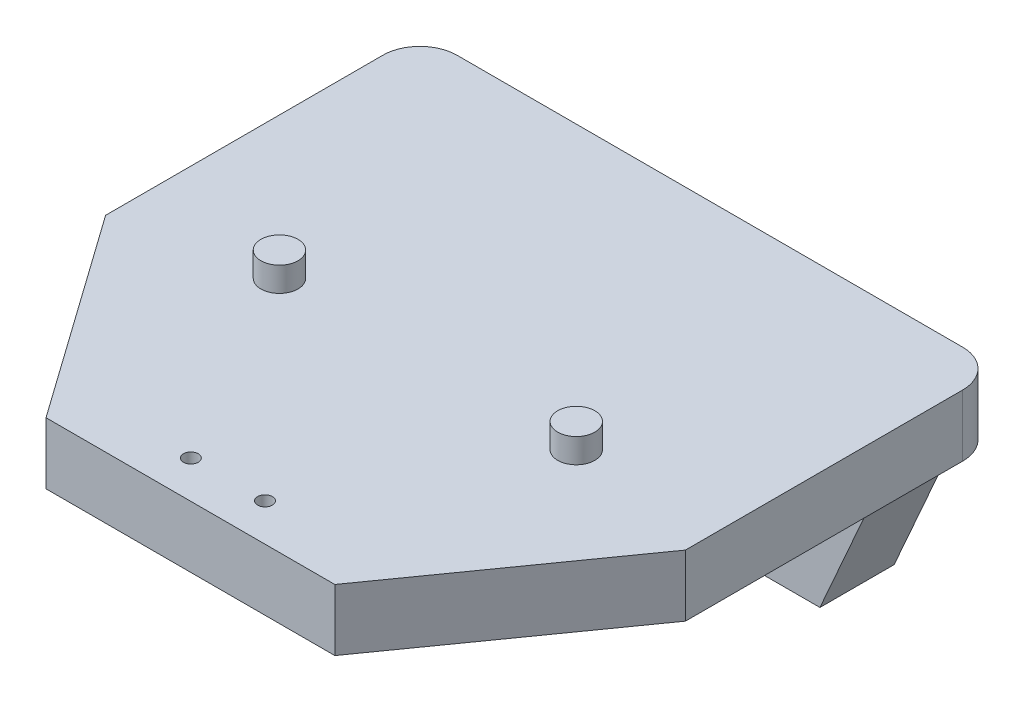
ISO-10303-21;
HEADER;
FILE_DESCRIPTION(('STEP AP214'),'2;1');
FILE_NAME('part.step','',(''),(''),'','','');
FILE_SCHEMA(('AUTOMOTIVE_DESIGN { 1 0 10303 214 1 1 1 1 }'));
ENDSEC;
DATA;
#1=APPLICATION_CONTEXT('core data for automotive mechanical design processes');
#2=APPLICATION_PROTOCOL_DEFINITION('international standard','automotive_design',2000,#1);
#3=PRODUCT_CONTEXT('',#1,'mechanical');
#4=PRODUCT('Part','Part','',(#3));
#5=PRODUCT_RELATED_PRODUCT_CATEGORY('part','',(#4));
#6=PRODUCT_DEFINITION_FORMATION('','',#4);
#7=PRODUCT_DEFINITION_CONTEXT('part definition',#1,'design');
#8=PRODUCT_DEFINITION('design','',#6,#7);
#9=PRODUCT_DEFINITION_SHAPE('','',#8);
#10=(LENGTH_UNIT() NAMED_UNIT(*) SI_UNIT(.MILLI.,.METRE.));
#11=(NAMED_UNIT(*) PLANE_ANGLE_UNIT() SI_UNIT($,.RADIAN.));
#12=(NAMED_UNIT(*) SI_UNIT($,.STERADIAN.) SOLID_ANGLE_UNIT());
#13=UNCERTAINTY_MEASURE_WITH_UNIT(LENGTH_MEASURE(1.E-05),#10,'distance_accuracy_value','');
#14=(GEOMETRIC_REPRESENTATION_CONTEXT(3) GLOBAL_UNCERTAINTY_ASSIGNED_CONTEXT((#13)) GLOBAL_UNIT_ASSIGNED_CONTEXT((#10,
#11,#12)) REPRESENTATION_CONTEXT('',''));
#15=CARTESIAN_POINT('',(0.,0.,0.));
#16=DIRECTION('',(0.,0.,1.));
#17=DIRECTION('',(1.,0.,0.));
#18=AXIS2_PLACEMENT_3D('',#15,#16,#17);
#19=CARTESIAN_POINT('',(-104.140000000012,4.99999999999999,10.));
#20=DIRECTION('',(0.,-1.,0.));
#21=DIRECTION('',(0.,0.,-1.));
#22=AXIS2_PLACEMENT_3D('',#19,#20,#21);
#23=PLANE('',#22);
#24=DIRECTION('',(0.,0.,-1.));
#25=VECTOR('',#24,1.);
#26=CARTESIAN_POINT('',(-104.140000000012,4.99999999999999,10.));
#27=LINE('',#26,#25);
#28=CARTESIAN_POINT('',(-104.140000000012,4.99999999999999,42.3558100361698));
#29=VERTEX_POINT('',#28);
#30=CARTESIAN_POINT('',(-104.140000000012,4.99999999999999,5.));
#31=VERTEX_POINT('',#30);
#32=EDGE_CURVE('E181',#29,#31,#27,.T.);
#33=ORIENTED_EDGE('',*,*,#32,.F.);
#34=DIRECTION('',(0.578556741023725,0.,0.815642138082631));
#35=VECTOR('',#34,1.);
#36=CARTESIAN_POINT('',(-119.408553300585,4.99999999999999,20.8303924298133));
#37=LINE('',#36,#35);
#38=CARTESIAN_POINT('',(-84.531238133795,4.99999999999999,70.));
#39=VERTEX_POINT('',#38);
#40=EDGE_CURVE('E138',#29,#39,#37,.T.);
#41=ORIENTED_EDGE('',*,*,#40,.T.);
#42=DIRECTION('',(-1.,0.,0.));
#43=VECTOR('',#42,1.);
#44=CARTESIAN_POINT('',(-25.9999999999991,4.99999999999999,70.));
#45=LINE('',#44,#43);
#46=CARTESIAN_POINT('',(-45.608761866216,4.99999999999999,70.));
#47=VERTEX_POINT('',#46);
#48=EDGE_CURVE('E275',#47,#39,#45,.T.);
#49=ORIENTED_EDGE('',*,*,#48,.F.);
#50=DIRECTION('',(0.578556741023725,0.,-0.815642138082631));
#51=VECTOR('',#50,1.);
#52=CARTESIAN_POINT('',(-36.8870850073432,4.99999999999999,57.7042878313898));
#53=LINE('',#52,#51);
#54=CARTESIAN_POINT('',(-25.9999999999991,4.99999999999999,42.3558100361698));
#55=VERTEX_POINT('',#54);
#56=EDGE_CURVE('E59',#47,#55,#53,.T.);
#57=ORIENTED_EDGE('',*,*,#56,.T.);
#58=DIRECTION('',(0.,0.,-1.));
#59=VECTOR('',#58,1.);
#60=CARTESIAN_POINT('',(-25.9999999999991,4.99999999999999,10.));
#61=LINE('',#60,#59);
#62=CARTESIAN_POINT('',(-25.9999999999991,4.99999999999999,5.));
#63=VERTEX_POINT('',#62);
#64=EDGE_CURVE('E190',#55,#63,#61,.T.);
#65=ORIENTED_EDGE('',*,*,#64,.T.);
#66=CARTESIAN_POINT('',(-30.9999999999991,4.99999999999999,5.));
#67=DIRECTION('',(0.,-1.,0.));
#68=DIRECTION('',(0.,0.,-1.));
#69=AXIS2_PLACEMENT_3D('',#66,#67,#68);
#70=CIRCLE('',#69,5.);
#71=CARTESIAN_POINT('',(-30.9999999999991,4.99999999999999,0.));
#72=VERTEX_POINT('',#71);
#73=EDGE_CURVE('E216',#63,#72,#70,.F.);
#74=ORIENTED_EDGE('',*,*,#73,.T.);
#75=DIRECTION('',(-1.,0.,0.));
#76=VECTOR('',#75,1.);
#77=CARTESIAN_POINT('',(-104.140000000012,4.99999999999999,0.));
#78=LINE('',#77,#76);
#79=CARTESIAN_POINT('',(-99.1400000000119,4.99999999999999,0.));
#80=VERTEX_POINT('',#79);
#81=EDGE_CURVE('E169',#72,#80,#78,.T.);
#82=ORIENTED_EDGE('',*,*,#81,.T.);
#83=CARTESIAN_POINT('',(-99.1400000000119,4.99999999999999,5.));
#84=DIRECTION('',(0.,-1.,0.));
#85=DIRECTION('',(0.,0.,-1.));
#86=AXIS2_PLACEMENT_3D('',#83,#84,#85);
#87=CIRCLE('',#86,5.);
#88=EDGE_CURVE('E213',#80,#31,#87,.F.);
#89=ORIENTED_EDGE('',*,*,#88,.T.);
#90=EDGE_LOOP('',(#33,#41,#49,#57,#65,#74,#82,#89));
#91=FACE_BOUND('',#90,.T.);
#92=CARTESIAN_POINT('',(-85.0700000000055,4.99999999999999,38.));
#93=DIRECTION('',(0.,-1.,0.));
#94=DIRECTION('',(0.,0.,-1.));
#95=AXIS2_PLACEMENT_3D('',#92,#93,#94);
#96=CIRCLE('',#95,2.50000000000001);
#97=CARTESIAN_POINT('',(-85.0700000000055,4.99999999999999,35.5));
#98=VERTEX_POINT('',#97);
#99=EDGE_CURVE('E238',#98,#98,#96,.T.);
#100=ORIENTED_EDGE('',*,*,#99,.T.);
#101=EDGE_LOOP('',(#100));
#102=FACE_BOUND('',#101,.T.);
#103=CARTESIAN_POINT('',(-45.0700000000055,4.99999999999999,38.));
#104=DIRECTION('',(0.,-1.,0.));
#105=DIRECTION('',(0.,0.,-1.));
#106=AXIS2_PLACEMENT_3D('',#103,#104,#105);
#107=CIRCLE('',#106,2.5);
#108=CARTESIAN_POINT('',(-45.0700000000055,4.99999999999999,35.5));
#109=VERTEX_POINT('',#108);
#110=EDGE_CURVE('E11',#109,#109,#107,.F.);
#111=ORIENTED_EDGE('',*,*,#110,.F.);
#112=EDGE_LOOP('',(#111));
#113=FACE_BOUND('',#112,.T.);
#114=CARTESIAN_POINT('',(-70.0700000000055,4.99999999999999,64.9453335250818));
#115=DIRECTION('',(0.,-1.,0.));
#116=DIRECTION('',(0.,0.,-1.));
#117=AXIS2_PLACEMENT_3D('',#114,#115,#116);
#118=CIRCLE('',#117,0.999999999999998);
#119=CARTESIAN_POINT('',(-70.0700000000055,4.99999999999999,63.9453335250818));
#120=VERTEX_POINT('',#119);
#121=EDGE_CURVE('E420',#120,#120,#118,.F.);
#122=ORIENTED_EDGE('',*,*,#121,.F.);
#123=EDGE_LOOP('',(#122));
#124=FACE_BOUND('',#123,.T.);
#125=CARTESIAN_POINT('',(-60.0700000000055,4.99999999999999,64.9453335250818));
#126=DIRECTION('',(0.,-1.,0.));
#127=DIRECTION('',(0.,0.,-1.));
#128=AXIS2_PLACEMENT_3D('',#125,#126,#127);
#129=CIRCLE('',#128,0.999999999999998);
#130=CARTESIAN_POINT('',(-60.0700000000055,4.99999999999999,63.9453335250818));
#131=VERTEX_POINT('',#130);
#132=EDGE_CURVE('E253',#131,#131,#129,.T.);
#133=ORIENTED_EDGE('',*,*,#132,.T.);
#134=EDGE_LOOP('',(#133));
#135=FACE_BOUND('',#134,.T.);
#136=ADVANCED_FACE('F36',(#91,#102,#113,#124,#135),#23,.F.);
#137=CARTESIAN_POINT('',(-104.140000000012,-3.30000000000001,70.));
#138=DIRECTION('',(0.,1.,0.));
#139=DIRECTION('',(0.,0.,1.));
#140=AXIS2_PLACEMENT_3D('',#137,#138,#139);
#141=PLANE('',#140);
#142=DIRECTION('',(1.,0.,0.));
#143=VECTOR('',#142,1.);
#144=CARTESIAN_POINT('',(-104.140000000012,-3.30000000000001,70.));
#145=LINE('',#144,#143);
#146=CARTESIAN_POINT('',(-84.531238133795,-3.30000000000001,70.));
#147=VERTEX_POINT('',#146);
#148=CARTESIAN_POINT('',(-45.6087618662161,-3.30000000000001,70.));
#149=VERTEX_POINT('',#148);
#150=EDGE_CURVE('E152',#147,#149,#145,.T.);
#151=ORIENTED_EDGE('',*,*,#150,.F.);
#152=DIRECTION('',(0.578556741023725,0.,0.815642138082631));
#153=VECTOR('',#152,1.);
#154=CARTESIAN_POINT('',(-84.531238133795,-3.30000000000001,70.));
#155=LINE('',#154,#153);
#156=CARTESIAN_POINT('',(-104.140000000012,-3.30000000000001,42.3558100361698));
#157=VERTEX_POINT('',#156);
#158=EDGE_CURVE('E51',#157,#147,#155,.T.);
#159=ORIENTED_EDGE('',*,*,#158,.F.);
#160=DIRECTION('',(0.,0.,-1.));
#161=VECTOR('',#160,1.);
#162=CARTESIAN_POINT('',(-104.140000000012,-3.30000000000001,70.));
#163=LINE('',#162,#161);
#164=CARTESIAN_POINT('',(-104.140000000012,-3.30000000000001,10.));
#165=VERTEX_POINT('',#164);
#166=EDGE_CURVE('E148',#157,#165,#163,.T.);
#167=ORIENTED_EDGE('',*,*,#166,.T.);
#168=DIRECTION('',(1.,0.,0.));
#169=VECTOR('',#168,1.);
#170=CARTESIAN_POINT('',(-104.140000000012,-3.30000000000001,10.));
#171=LINE('',#170,#169);
#172=CARTESIAN_POINT('',(-25.9999999999991,-3.30000000000001,10.));
#173=VERTEX_POINT('',#172);
#174=EDGE_CURVE('E272',#165,#173,#171,.T.);
#175=ORIENTED_EDGE('',*,*,#174,.T.);
#176=DIRECTION('',(0.,0.,-1.));
#177=VECTOR('',#176,1.);
#178=CARTESIAN_POINT('',(-25.9999999999991,-3.30000000000001,70.));
#179=LINE('',#178,#177);
#180=CARTESIAN_POINT('',(-25.9999999999991,-3.30000000000001,42.3558100361698));
#181=VERTEX_POINT('',#180);
#182=EDGE_CURVE('E160',#181,#173,#179,.T.);
#183=ORIENTED_EDGE('',*,*,#182,.F.);
#184=DIRECTION('',(0.578556741023725,0.,-0.815642138082631));
#185=VECTOR('',#184,1.);
#186=CARTESIAN_POINT('',(-45.6087618662161,-3.30000000000001,70.));
#187=LINE('',#186,#185);
#188=EDGE_CURVE('E261',#149,#181,#187,.T.);
#189=ORIENTED_EDGE('',*,*,#188,.F.);
#190=EDGE_LOOP('',(#151,#159,#167,#175,#183,#189));
#191=FACE_BOUND('',#190,.T.);
#192=CARTESIAN_POINT('',(-85.0700000000055,-3.30000000000001,38.));
#193=DIRECTION('',(0.,1.,0.));
#194=DIRECTION('',(0.,0.,1.));
#195=AXIS2_PLACEMENT_3D('',#192,#193,#194);
#196=CIRCLE('',#195,2.50000000000001);
#197=CARTESIAN_POINT('',(-85.0700000000055,-3.30000000000001,40.5));
#198=VERTEX_POINT('',#197);
#199=EDGE_CURVE('E44',#198,#198,#196,.F.);
#200=ORIENTED_EDGE('',*,*,#199,.F.);
#201=EDGE_LOOP('',(#200));
#202=FACE_BOUND('',#201,.T.);
#203=CARTESIAN_POINT('',(-45.0700000000055,-3.30000000000001,38.));
#204=DIRECTION('',(0.,1.,0.));
#205=DIRECTION('',(0.,0.,1.));
#206=AXIS2_PLACEMENT_3D('',#203,#204,#205);
#207=CIRCLE('',#206,2.5);
#208=CARTESIAN_POINT('',(-45.0700000000055,-3.30000000000001,40.5));
#209=VERTEX_POINT('',#208);
#210=EDGE_CURVE('E245',#209,#209,#207,.T.);
#211=ORIENTED_EDGE('',*,*,#210,.T.);
#212=EDGE_LOOP('',(#211));
#213=FACE_BOUND('',#212,.T.);
#214=CARTESIAN_POINT('',(-70.0700000000055,-3.30000000000001,64.9453335250818));
#215=DIRECTION('',(0.,1.,0.));
#216=DIRECTION('',(0.,0.,1.));
#217=AXIS2_PLACEMENT_3D('',#214,#215,#216);
#218=CIRCLE('',#217,0.999999999999998);
#219=CARTESIAN_POINT('',(-70.0700000000055,-3.30000000000001,65.9453335250818));
#220=VERTEX_POINT('',#219);
#221=EDGE_CURVE('E424',#220,#220,#218,.T.);
#222=ORIENTED_EDGE('',*,*,#221,.T.);
#223=EDGE_LOOP('',(#222));
#224=FACE_BOUND('',#223,.T.);
#225=CARTESIAN_POINT('',(-60.0700000000055,-3.30000000000001,64.9453335250818));
#226=DIRECTION('',(0.,-1.,0.));
#227=DIRECTION('',(0.,0.,-1.));
#228=AXIS2_PLACEMENT_3D('',#225,#226,#227);
#229=CIRCLE('',#228,0.999999999999998);
#230=CARTESIAN_POINT('',(-60.0700000000055,-3.30000000000001,63.9453335250818));
#231=VERTEX_POINT('',#230);
#232=EDGE_CURVE('E416',#231,#231,#229,.T.);
#233=ORIENTED_EDGE('',*,*,#232,.F.);
#234=EDGE_LOOP('',(#233));
#235=FACE_BOUND('',#234,.T.);
#236=ADVANCED_FACE('F145',(#191,#202,#213,#224,#235),#141,.F.);
#237=CARTESIAN_POINT('',(-104.140000000012,4.99999999999999,10.));
#238=DIRECTION('',(1.,0.,0.));
#239=DIRECTION('',(0.,0.,-1.));
#240=AXIS2_PLACEMENT_3D('',#237,#238,#239);
#241=PLANE('',#240);
#242=ORIENTED_EDGE('',*,*,#166,.F.);
#243=DIRECTION('',(0.,-1.,0.));
#244=VECTOR('',#243,1.);
#245=CARTESIAN_POINT('',(-104.140000000012,6.69999999999999,42.3558100361698));
#246=LINE('',#245,#244);
#247=EDGE_CURVE('E135',#29,#157,#246,.T.);
#248=ORIENTED_EDGE('',*,*,#247,.F.);
#249=ORIENTED_EDGE('',*,*,#32,.T.);
#250=DIRECTION('',(0.,-1.,0.));
#251=VECTOR('',#250,1.);
#252=CARTESIAN_POINT('',(-104.140000000012,4.99999999999999,5.));
#253=LINE('',#252,#251);
#254=CARTESIAN_POINT('',(-104.140000000012,-3.30308783227906,5.));
#255=VERTEX_POINT('',#254);
#256=EDGE_CURVE('E226',#31,#255,#253,.T.);
#257=ORIENTED_EDGE('',*,*,#256,.T.);
#258=DIRECTION('',(0.,0.,-1.));
#259=VECTOR('',#258,1.);
#260=CARTESIAN_POINT('',(-104.140000000012,-3.30308783227906,10.));
#261=LINE('',#260,#259);
#262=CARTESIAN_POINT('',(-104.140000000012,-3.30308783227906,10.));
#263=VERTEX_POINT('',#262);
#264=EDGE_CURVE('E207',#263,#255,#261,.T.);
#265=ORIENTED_EDGE('',*,*,#264,.F.);
#266=DIRECTION('',(0.,-1.,0.));
#267=VECTOR('',#266,1.);
#268=CARTESIAN_POINT('',(-104.140000000012,4.99999999999999,10.));
#269=LINE('',#268,#267);
#270=EDGE_CURVE('E158',#165,#263,#269,.T.);
#271=ORIENTED_EDGE('',*,*,#270,.F.);
#272=EDGE_LOOP('',(#242,#248,#249,#257,#265,#271));
#273=FACE_BOUND('',#272,.T.);
#274=ADVANCED_FACE('F156',(#273),#241,.F.);
#275=CARTESIAN_POINT('',(-104.140000000012,-3.30308783227906,10.));
#276=DIRECTION('',(0.,1.,0.));
#277=DIRECTION('',(0.,0.,1.));
#278=AXIS2_PLACEMENT_3D('',#275,#276,#277);
#279=PLANE('',#278);
#280=ORIENTED_EDGE('',*,*,#264,.T.);
#281=CARTESIAN_POINT('',(-99.1400000000119,-3.30308783227906,5.));
#282=DIRECTION('',(0.,1.,0.));
#283=DIRECTION('',(0.,0.,1.));
#284=AXIS2_PLACEMENT_3D('',#281,#282,#283);
#285=CIRCLE('',#284,5.);
#286=CARTESIAN_POINT('',(-99.4984375162096,-3.30308783227906,0.0128642943086118));
#287=VERTEX_POINT('',#286);
#288=EDGE_CURVE('E229',#255,#287,#285,.F.);
#289=ORIENTED_EDGE('',*,*,#288,.T.);
#290=DIRECTION('',(0.,0.,-1.));
#291=VECTOR('',#290,1.);
#292=CARTESIAN_POINT('',(-99.4984375162096,-3.30308783227906,10.));
#293=LINE('',#292,#291);
#294=CARTESIAN_POINT('',(-99.4984375162096,-3.30308783227906,10.));
#295=VERTEX_POINT('',#294);
#296=EDGE_CURVE('E204',#295,#287,#293,.T.);
#297=ORIENTED_EDGE('',*,*,#296,.F.);
#298=DIRECTION('',(1.,0.,0.));
#299=VECTOR('',#298,1.);
#300=CARTESIAN_POINT('',(-104.140000000012,-3.30308783227906,10.));
#301=LINE('',#300,#299);
#302=EDGE_CURVE('E168',#263,#295,#301,.T.);
#303=ORIENTED_EDGE('',*,*,#302,.F.);
#304=EDGE_LOOP('',(#280,#289,#297,#303));
#305=FACE_BOUND('',#304,.T.);
#306=ADVANCED_FACE('F333',(#305),#279,.F.);
#307=CARTESIAN_POINT('',(-99.4984375162096,-3.30308783227906,10.));
#308=DIRECTION('',(0.914598558718786,0.404363050227787,0.));
#309=DIRECTION('',(-0.404363050227787,0.914598558718786,0.));
#310=AXIS2_PLACEMENT_3D('',#307,#308,#309);
#311=PLANE('',#310);
#312=ORIENTED_EDGE('',*,*,#296,.T.);
#313=CARTESIAN_POINT('',(-99.1400000000119,-4.11381085833337,5.));
#314=DIRECTION('',(0.914598558718786,0.404363050227787,0.));
#315=DIRECTION('',(0.404363050227787,-0.914598558718786,0.));
#316=AXIS2_PLACEMENT_3D('',#313,#314,#315);
#317=ELLIPSE('',#316,12.365125837248,5.);
#318=CARTESIAN_POINT('',(-99.1400000000119,-4.11381085833337,0.));
#319=VERTEX_POINT('',#318);
#320=EDGE_CURVE('E231',#287,#319,#317,.F.);
#321=ORIENTED_EDGE('',*,*,#320,.T.);
#322=DIRECTION('',(0.404363050227787,-0.914598558718786,0.));
#323=VECTOR('',#322,1.);
#324=CARTESIAN_POINT('',(-99.4984375162096,-3.30308783227906,0.));
#325=LINE('',#324,#323);
#326=CARTESIAN_POINT('',(-89.9057812616948,-25.0000000000001,0.));
#327=VERTEX_POINT('',#326);
#328=EDGE_CURVE('E159',#319,#327,#325,.T.);
#329=ORIENTED_EDGE('',*,*,#328,.T.);
#330=DIRECTION('',(0.,0.,-1.));
#331=VECTOR('',#330,1.);
#332=CARTESIAN_POINT('',(-89.9057812616948,-25.0000000000001,10.));
#333=LINE('',#332,#331);
#334=CARTESIAN_POINT('',(-89.9057812616948,-25.0000000000001,10.));
#335=VERTEX_POINT('',#334);
#336=EDGE_CURVE('E201',#335,#327,#333,.T.);
#337=ORIENTED_EDGE('',*,*,#336,.F.);
#338=DIRECTION('',(0.404363050227787,-0.914598558718786,0.));
#339=VECTOR('',#338,1.);
#340=CARTESIAN_POINT('',(-99.4984375162096,-3.30308783227906,10.));
#341=LINE('',#340,#339);
#342=EDGE_CURVE('E171',#295,#335,#341,.T.);
#343=ORIENTED_EDGE('',*,*,#342,.F.);
#344=EDGE_LOOP('',(#312,#321,#329,#337,#343));
#345=FACE_BOUND('',#344,.T.);
#346=ADVANCED_FACE('F329',(#345),#311,.F.);
#347=CARTESIAN_POINT('',(-89.9057812616948,-25.0000000000001,10.));
#348=DIRECTION('',(0.,1.,0.));
#349=DIRECTION('',(0.,0.,1.));
#350=AXIS2_PLACEMENT_3D('',#347,#348,#349);
#351=PLANE('',#350);
#352=DIRECTION('',(1.,0.,0.));
#353=VECTOR('',#352,1.);
#354=CARTESIAN_POINT('',(-89.9057812616948,-25.0000000000001,0.));
#355=LINE('',#354,#353);
#356=CARTESIAN_POINT('',(-40.2342187383163,-25.0000000000001,0.));
#357=VERTEX_POINT('',#356);
#358=EDGE_CURVE('E162',#327,#357,#355,.T.);
#359=ORIENTED_EDGE('',*,*,#358,.T.);
#360=DIRECTION('',(0.,0.,-1.));
#361=VECTOR('',#360,1.);
#362=CARTESIAN_POINT('',(-40.2342187383163,-25.0000000000001,10.));
#363=LINE('',#362,#361);
#364=CARTESIAN_POINT('',(-40.2342187383163,-25.0000000000001,10.));
#365=VERTEX_POINT('',#364);
#366=EDGE_CURVE('E198',#365,#357,#363,.T.);
#367=ORIENTED_EDGE('',*,*,#366,.F.);
#368=DIRECTION('',(1.,0.,0.));
#369=VECTOR('',#368,1.);
#370=CARTESIAN_POINT('',(-89.9057812616948,-25.0000000000001,10.));
#371=LINE('',#370,#369);
#372=EDGE_CURVE('E173',#335,#365,#371,.T.);
#373=ORIENTED_EDGE('',*,*,#372,.F.);
#374=ORIENTED_EDGE('',*,*,#336,.T.);
#375=EDGE_LOOP('',(#359,#367,#373,#374));
#376=FACE_BOUND('',#375,.T.);
#377=ADVANCED_FACE('F325',(#376),#351,.F.);
#378=CARTESIAN_POINT('',(-30.6415624838014,-3.30308783227906,10.));
#379=DIRECTION('',(-0.914598558718786,0.404363050227787,0.));
#380=DIRECTION('',(-0.404363050227787,-0.914598558718786,0.));
#381=AXIS2_PLACEMENT_3D('',#378,#379,#380);
#382=PLANE('',#381);
#383=DIRECTION('',(0.404363050227787,0.914598558718786,0.));
#384=VECTOR('',#383,1.);
#385=CARTESIAN_POINT('',(-30.6415624838014,-3.30308783227906,0.));
#386=LINE('',#385,#384);
#387=CARTESIAN_POINT('',(-30.9999999999991,-4.11381085833336,0.));
#388=VERTEX_POINT('',#387);
#389=EDGE_CURVE('E184',#357,#388,#386,.T.);
#390=ORIENTED_EDGE('',*,*,#389,.T.);
#391=CARTESIAN_POINT('',(-30.9999999999991,-4.11381085833336,5.));
#392=DIRECTION('',(-0.914598558718786,0.404363050227787,0.));
#393=DIRECTION('',(0.404363050227787,0.914598558718786,0.));
#394=AXIS2_PLACEMENT_3D('',#391,#392,#393);
#395=ELLIPSE('',#394,12.365125837248,5.);
#396=CARTESIAN_POINT('',(-30.6415624838014,-3.30308783227906,0.0128642943086083));
#397=VERTEX_POINT('',#396);
#398=EDGE_CURVE('E222',#388,#397,#395,.F.);
#399=ORIENTED_EDGE('',*,*,#398,.T.);
#400=DIRECTION('',(0.,0.,-1.));
#401=VECTOR('',#400,1.);
#402=CARTESIAN_POINT('',(-30.6415624838014,-3.30308783227906,10.));
#403=LINE('',#402,#401);
#404=CARTESIAN_POINT('',(-30.6415624838014,-3.30308783227906,10.));
#405=VERTEX_POINT('',#404);
#406=EDGE_CURVE('E195',#405,#397,#403,.T.);
#407=ORIENTED_EDGE('',*,*,#406,.F.);
#408=DIRECTION('',(0.404363050227787,0.914598558718786,0.));
#409=VECTOR('',#408,1.);
#410=CARTESIAN_POINT('',(-30.6415624838014,-3.30308783227906,10.));
#411=LINE('',#410,#409);
#412=EDGE_CURVE('E175',#365,#405,#411,.T.);
#413=ORIENTED_EDGE('',*,*,#412,.F.);
#414=ORIENTED_EDGE('',*,*,#366,.T.);
#415=EDGE_LOOP('',(#390,#399,#407,#413,#414));
#416=FACE_BOUND('',#415,.T.);
#417=ADVANCED_FACE('F321',(#416),#382,.F.);
#418=CARTESIAN_POINT('',(-25.9999999999991,-3.30308783227906,10.));
#419=DIRECTION('',(0.,1.,0.));
#420=DIRECTION('',(0.,0.,1.));
#421=AXIS2_PLACEMENT_3D('',#418,#419,#420);
#422=PLANE('',#421);
#423=ORIENTED_EDGE('',*,*,#406,.T.);
#424=CARTESIAN_POINT('',(-30.9999999999991,-3.30308783227906,5.));
#425=DIRECTION('',(0.,1.,0.));
#426=DIRECTION('',(0.,0.,1.));
#427=AXIS2_PLACEMENT_3D('',#424,#425,#426);
#428=CIRCLE('',#427,5.);
#429=CARTESIAN_POINT('',(-25.9999999999991,-3.30308783227906,5.));
#430=VERTEX_POINT('',#429);
#431=EDGE_CURVE('E224',#397,#430,#428,.F.);
#432=ORIENTED_EDGE('',*,*,#431,.T.);
#433=DIRECTION('',(0.,0.,-1.));
#434=VECTOR('',#433,1.);
#435=CARTESIAN_POINT('',(-25.9999999999991,-3.30308783227906,10.));
#436=LINE('',#435,#434);
#437=CARTESIAN_POINT('',(-25.9999999999991,-3.30308783227906,10.));
#438=VERTEX_POINT('',#437);
#439=EDGE_CURVE('E192',#438,#430,#436,.T.);
#440=ORIENTED_EDGE('',*,*,#439,.F.);
#441=DIRECTION('',(1.,0.,0.));
#442=VECTOR('',#441,1.);
#443=CARTESIAN_POINT('',(-25.9999999999991,-3.30308783227906,10.));
#444=LINE('',#443,#442);
#445=EDGE_CURVE('E177',#405,#438,#444,.T.);
#446=ORIENTED_EDGE('',*,*,#445,.F.);
#447=EDGE_LOOP('',(#423,#432,#440,#446));
#448=FACE_BOUND('',#447,.T.);
#449=ADVANCED_FACE('F318',(#448),#422,.F.);
#450=CARTESIAN_POINT('',(-25.9999999999991,4.99999999999999,10.));
#451=DIRECTION('',(-1.,0.,0.));
#452=DIRECTION('',(0.,0.,1.));
#453=AXIS2_PLACEMENT_3D('',#450,#451,#452);
#454=PLANE('',#453);
#455=ORIENTED_EDGE('',*,*,#64,.F.);
#456=DIRECTION('',(0.,-1.,0.));
#457=VECTOR('',#456,1.);
#458=CARTESIAN_POINT('',(-25.9999999999991,6.69999999999999,42.3558100361698));
#459=LINE('',#458,#457);
#460=EDGE_CURVE('E153',#55,#181,#459,.T.);
#461=ORIENTED_EDGE('',*,*,#460,.T.);
#462=ORIENTED_EDGE('',*,*,#182,.T.);
#463=DIRECTION('',(0.,1.,0.));
#464=VECTOR('',#463,1.);
#465=CARTESIAN_POINT('',(-25.9999999999991,4.99999999999999,10.));
#466=LINE('',#465,#464);
#467=EDGE_CURVE('E179',#438,#173,#466,.T.);
#468=ORIENTED_EDGE('',*,*,#467,.F.);
#469=ORIENTED_EDGE('',*,*,#439,.T.);
#470=DIRECTION('',(0.,1.,0.));
#471=VECTOR('',#470,1.);
#472=CARTESIAN_POINT('',(-25.9999999999991,4.99999999999999,5.));
#473=LINE('',#472,#471);
#474=EDGE_CURVE('E210',#430,#63,#473,.T.);
#475=ORIENTED_EDGE('',*,*,#474,.T.);
#476=EDGE_LOOP('',(#455,#461,#462,#468,#469,#475));
#477=FACE_BOUND('',#476,.T.);
#478=ADVANCED_FACE('F287',(#477),#454,.F.);
#479=CARTESIAN_POINT('',(0.,0.,10.));
#480=DIRECTION('',(0.,0.,1.));
#481=DIRECTION('',(1.,0.,0.));
#482=AXIS2_PLACEMENT_3D('',#479,#480,#481);
#483=PLANE('',#482);
#484=CARTESIAN_POINT('',(-65.0700000000056,-13.5000000000001,10.));
#485=DIRECTION('',(0.,0.,1.));
#486=DIRECTION('',(1.,0.,0.));
#487=AXIS2_PLACEMENT_3D('',#484,#485,#486);
#488=CIRCLE('',#487,7.5);
#489=CARTESIAN_POINT('',(-57.5700000000056,-13.5000000000001,10.));
#490=VERTEX_POINT('',#489);
#491=EDGE_CURVE('E268',#490,#490,#488,.T.);
#492=ORIENTED_EDGE('',*,*,#491,.F.);
#493=EDGE_LOOP('',(#492));
#494=FACE_BOUND('',#493,.T.);
#495=ORIENTED_EDGE('',*,*,#174,.F.);
#496=ORIENTED_EDGE('',*,*,#270,.T.);
#497=ORIENTED_EDGE('',*,*,#302,.T.);
#498=ORIENTED_EDGE('',*,*,#342,.T.);
#499=ORIENTED_EDGE('',*,*,#372,.T.);
#500=ORIENTED_EDGE('',*,*,#412,.T.);
#501=ORIENTED_EDGE('',*,*,#445,.T.);
#502=ORIENTED_EDGE('',*,*,#467,.T.);
#503=EDGE_LOOP('',(#495,#496,#497,#498,#499,#500,#501,#502));
#504=FACE_BOUND('',#503,.T.);
#505=ADVANCED_FACE('F280',(#494,#504),#483,.T.);
#506=CARTESIAN_POINT('',(0.,0.,0.));
#507=DIRECTION('',(0.,0.,1.));
#508=DIRECTION('',(1.,0.,0.));
#509=AXIS2_PLACEMENT_3D('',#506,#507,#508);
#510=PLANE('',#509);
#511=CARTESIAN_POINT('',(-65.0700000000056,-13.5000000000001,0.));
#512=DIRECTION('',(0.,0.,1.));
#513=DIRECTION('',(1.,0.,0.));
#514=AXIS2_PLACEMENT_3D('',#511,#512,#513);
#515=CIRCLE('',#514,7.5);
#516=CARTESIAN_POINT('',(-57.5700000000056,-13.5000000000001,0.));
#517=VERTEX_POINT('',#516);
#518=EDGE_CURVE('E269',#517,#517,#515,.T.);
#519=ORIENTED_EDGE('',*,*,#518,.T.);
#520=EDGE_LOOP('',(#519));
#521=FACE_BOUND('',#520,.T.);
#522=ORIENTED_EDGE('',*,*,#81,.F.);
#523=DIRECTION('',(0.,1.,0.));
#524=VECTOR('',#523,1.);
#525=CARTESIAN_POINT('',(-30.9999999999991,0.,0.));
#526=LINE('',#525,#524);
#527=EDGE_CURVE('E220',#72,#388,#526,.F.);
#528=ORIENTED_EDGE('',*,*,#527,.T.);
#529=ORIENTED_EDGE('',*,*,#389,.F.);
#530=ORIENTED_EDGE('',*,*,#358,.F.);
#531=ORIENTED_EDGE('',*,*,#328,.F.);
#532=DIRECTION('',(0.,-1.,0.));
#533=VECTOR('',#532,1.);
#534=CARTESIAN_POINT('',(-99.1400000000119,0.,0.));
#535=LINE('',#534,#533);
#536=EDGE_CURVE('E218',#319,#80,#535,.F.);
#537=ORIENTED_EDGE('',*,*,#536,.T.);
#538=EDGE_LOOP('',(#522,#528,#529,#530,#531,#537));
#539=FACE_BOUND('',#538,.T.);
#540=ADVANCED_FACE('F297',(#521,#539),#510,.F.);
#541=CARTESIAN_POINT('',(0.,0.,70.));
#542=DIRECTION('',(0.,0.,1.));
#543=DIRECTION('',(1.,0.,0.));
#544=AXIS2_PLACEMENT_3D('',#541,#542,#543);
#545=PLANE('',#544);
#546=DIRECTION('',(0.,1.,0.));
#547=VECTOR('',#546,1.);
#548=CARTESIAN_POINT('',(-84.531238133795,0.,70.));
#549=LINE('',#548,#547);
#550=EDGE_CURVE('E235',#147,#39,#549,.T.);
#551=ORIENTED_EDGE('',*,*,#550,.F.);
#552=ORIENTED_EDGE('',*,*,#150,.T.);
#553=DIRECTION('',(0.,-1.,0.));
#554=VECTOR('',#553,1.);
#555=CARTESIAN_POINT('',(-45.608761866216,0.,70.));
#556=LINE('',#555,#554);
#557=EDGE_CURVE('E233',#47,#149,#556,.T.);
#558=ORIENTED_EDGE('',*,*,#557,.F.);
#559=ORIENTED_EDGE('',*,*,#48,.T.);
#560=EDGE_LOOP('',(#551,#552,#558,#559));
#561=FACE_BOUND('',#560,.T.);
#562=ADVANCED_FACE('F294',(#561),#545,.T.);
#563=CARTESIAN_POINT('',(-65.0700000000056,-13.5000000000001,0.));
#564=DIRECTION('',(0.,0.,1.));
#565=DIRECTION('',(1.,0.,0.));
#566=AXIS2_PLACEMENT_3D('',#563,#564,#565);
#567=CYLINDRICAL_SURFACE('',#566,7.5);
#568=ORIENTED_EDGE('',*,*,#518,.F.);
#569=EDGE_LOOP('',(#568));
#570=FACE_BOUND('',#569,.T.);
#571=ORIENTED_EDGE('',*,*,#491,.T.);
#572=EDGE_LOOP('',(#571));
#573=FACE_BOUND('',#572,.T.);
#574=ADVANCED_FACE('F296',(#570,#573),#567,.F.);
#575=CARTESIAN_POINT('',(-30.9999999999991,4.99999999999999,5.));
#576=DIRECTION('',(0.,1.,0.));
#577=DIRECTION('',(0.,0.,1.));
#578=AXIS2_PLACEMENT_3D('',#575,#576,#577);
#579=CYLINDRICAL_SURFACE('',#578,5.);
#580=ORIENTED_EDGE('',*,*,#398,.F.);
#581=ORIENTED_EDGE('',*,*,#527,.F.);
#582=ORIENTED_EDGE('',*,*,#73,.F.);
#583=ORIENTED_EDGE('',*,*,#474,.F.);
#584=ORIENTED_EDGE('',*,*,#431,.F.);
#585=EDGE_LOOP('',(#580,#581,#582,#583,#584));
#586=FACE_BOUND('',#585,.T.);
#587=ADVANCED_FACE('F303',(#586),#579,.T.);
#588=CARTESIAN_POINT('',(-99.1400000000119,4.99999999999999,5.));
#589=DIRECTION('',(0.,-1.,0.));
#590=DIRECTION('',(0.,0.,-1.));
#591=AXIS2_PLACEMENT_3D('',#588,#589,#590);
#592=CYLINDRICAL_SURFACE('',#591,5.);
#593=ORIENTED_EDGE('',*,*,#88,.F.);
#594=ORIENTED_EDGE('',*,*,#536,.F.);
#595=ORIENTED_EDGE('',*,*,#320,.F.);
#596=ORIENTED_EDGE('',*,*,#288,.F.);
#597=ORIENTED_EDGE('',*,*,#256,.F.);
#598=EDGE_LOOP('',(#593,#594,#595,#596,#597));
#599=FACE_BOUND('',#598,.T.);
#600=ADVANCED_FACE('F38',(#599),#592,.T.);
#601=CARTESIAN_POINT('',(-45.6087618662161,6.69999999999999,70.));
#602=DIRECTION('',(-0.815642138082631,0.,-0.578556741023725));
#603=DIRECTION('',(-0.578556741023725,0.,0.815642138082631));
#604=AXIS2_PLACEMENT_3D('',#601,#602,#603);
#605=PLANE('',#604);
#606=ORIENTED_EDGE('',*,*,#557,.T.);
#607=ORIENTED_EDGE('',*,*,#188,.T.);
#608=ORIENTED_EDGE('',*,*,#460,.F.);
#609=ORIENTED_EDGE('',*,*,#56,.F.);
#610=EDGE_LOOP('',(#606,#607,#608,#609));
#611=FACE_BOUND('',#610,.T.);
#612=ADVANCED_FACE('F289',(#611),#605,.F.);
#613=CARTESIAN_POINT('',(-84.531238133795,6.69999999999999,70.));
#614=DIRECTION('',(0.815642138082631,0.,-0.578556741023725));
#615=DIRECTION('',(-0.578556741023725,0.,-0.815642138082631));
#616=AXIS2_PLACEMENT_3D('',#613,#614,#615);
#617=PLANE('',#616);
#618=ORIENTED_EDGE('',*,*,#247,.T.);
#619=ORIENTED_EDGE('',*,*,#158,.T.);
#620=ORIENTED_EDGE('',*,*,#550,.T.);
#621=ORIENTED_EDGE('',*,*,#40,.F.);
#622=EDGE_LOOP('',(#618,#619,#620,#621));
#623=FACE_BOUND('',#622,.T.);
#624=ADVANCED_FACE('F136',(#623),#617,.F.);
#625=CARTESIAN_POINT('',(-85.0700000000055,-8.30000000000001,38.));
#626=DIRECTION('',(0.,1.,0.));
#627=DIRECTION('',(0.,0.,1.));
#628=AXIS2_PLACEMENT_3D('',#625,#626,#627);
#629=CYLINDRICAL_SURFACE('',#628,2.50000000000001);
#630=CARTESIAN_POINT('',(-85.0700000000055,-8.30000000000001,38.));
#631=DIRECTION('',(0.,-1.,0.));
#632=DIRECTION('',(0.,0.,-1.));
#633=AXIS2_PLACEMENT_3D('',#630,#631,#632);
#634=CIRCLE('',#633,2.50000000000001);
#635=CARTESIAN_POINT('',(-85.0700000000055,-8.30000000000001,35.5));
#636=VERTEX_POINT('',#635);
#637=EDGE_CURVE('E258',#636,#636,#634,.T.);
#638=ORIENTED_EDGE('',*,*,#637,.F.);
#639=EDGE_LOOP('',(#638));
#640=FACE_BOUND('',#639,.T.);
#641=ORIENTED_EDGE('',*,*,#199,.T.);
#642=EDGE_LOOP('',(#641));
#643=FACE_BOUND('',#642,.T.);
#644=ADVANCED_FACE('F371',(#640,#643),#629,.T.);
#645=CARTESIAN_POINT('',(-85.0700000000055,-8.30000000000001,38.));
#646=DIRECTION('',(0.,-1.,0.));
#647=DIRECTION('',(0.,0.,-1.));
#648=AXIS2_PLACEMENT_3D('',#645,#646,#647);
#649=PLANE('',#648);
#650=ORIENTED_EDGE('',*,*,#637,.T.);
#651=EDGE_LOOP('',(#650));
#652=FACE_BOUND('',#651,.T.);
#653=ADVANCED_FACE('F376',(#652),#649,.T.);
#654=CARTESIAN_POINT('',(-45.0700000000055,-8.30000000000001,38.));
#655=DIRECTION('',(0.,1.,0.));
#656=DIRECTION('',(0.,0.,1.));
#657=AXIS2_PLACEMENT_3D('',#654,#655,#656);
#658=CYLINDRICAL_SURFACE('',#657,2.5);
#659=CARTESIAN_POINT('',(-45.0700000000055,-8.30000000000001,38.));
#660=DIRECTION('',(0.,1.,0.));
#661=DIRECTION('',(0.,0.,1.));
#662=AXIS2_PLACEMENT_3D('',#659,#660,#661);
#663=CIRCLE('',#662,2.5);
#664=CARTESIAN_POINT('',(-45.0700000000055,-8.30000000000001,40.5));
#665=VERTEX_POINT('',#664);
#666=EDGE_CURVE('E240',#665,#665,#663,.T.);
#667=ORIENTED_EDGE('',*,*,#666,.T.);
#668=EDGE_LOOP('',(#667));
#669=FACE_BOUND('',#668,.T.);
#670=ORIENTED_EDGE('',*,*,#210,.F.);
#671=EDGE_LOOP('',(#670));
#672=FACE_BOUND('',#671,.T.);
#673=ADVANCED_FACE('F380',(#669,#672),#658,.T.);
#674=CARTESIAN_POINT('',(-45.0700000000055,-8.30000000000001,38.));
#675=DIRECTION('',(0.,1.,0.));
#676=DIRECTION('',(0.,0.,1.));
#677=AXIS2_PLACEMENT_3D('',#674,#675,#676);
#678=PLANE('',#677);
#679=ORIENTED_EDGE('',*,*,#666,.F.);
#680=EDGE_LOOP('',(#679));
#681=FACE_BOUND('',#680,.T.);
#682=ADVANCED_FACE('F382',(#681),#678,.F.);
#683=CARTESIAN_POINT('',(-85.0700000000055,8.30000000000001,38.));
#684=DIRECTION('',(0.,-1.,0.));
#685=DIRECTION('',(0.,0.,-1.));
#686=AXIS2_PLACEMENT_3D('',#683,#684,#685);
#687=CYLINDRICAL_SURFACE('',#686,2.50000000000001);
#688=CARTESIAN_POINT('',(-85.0700000000055,8.30000000000001,38.));
#689=DIRECTION('',(0.,-1.,0.));
#690=DIRECTION('',(0.,0.,-1.));
#691=AXIS2_PLACEMENT_3D('',#688,#689,#690);
#692=CIRCLE('',#691,2.50000000000001);
#693=CARTESIAN_POINT('',(-85.0700000000055,8.30000000000001,35.5));
#694=VERTEX_POINT('',#693);
#695=EDGE_CURVE('E241',#694,#694,#692,.T.);
#696=ORIENTED_EDGE('',*,*,#695,.T.);
#697=EDGE_LOOP('',(#696));
#698=FACE_BOUND('',#697,.T.);
#699=ORIENTED_EDGE('',*,*,#99,.F.);
#700=EDGE_LOOP('',(#699));
#701=FACE_BOUND('',#700,.T.);
#702=ADVANCED_FACE('F385',(#698,#701),#687,.T.);
#703=CARTESIAN_POINT('',(-85.0700000000055,8.30000000000001,38.));
#704=DIRECTION('',(0.,1.,0.));
#705=DIRECTION('',(0.,0.,-1.));
#706=AXIS2_PLACEMENT_3D('',#703,#704,#705);
#707=PLANE('',#706);
#708=ORIENTED_EDGE('',*,*,#695,.F.);
#709=EDGE_LOOP('',(#708));
#710=FACE_BOUND('',#709,.T.);
#711=ADVANCED_FACE('F392',(#710),#707,.T.);
#712=CARTESIAN_POINT('',(-45.0700000000055,8.30000000000001,38.));
#713=DIRECTION('',(0.,-1.,0.));
#714=DIRECTION('',(0.,0.,-1.));
#715=AXIS2_PLACEMENT_3D('',#712,#713,#714);
#716=CYLINDRICAL_SURFACE('',#715,2.5);
#717=CARTESIAN_POINT('',(-45.0700000000055,8.30000000000001,38.));
#718=DIRECTION('',(0.,1.,0.));
#719=DIRECTION('',(0.,0.,1.));
#720=AXIS2_PLACEMENT_3D('',#717,#718,#719);
#721=CIRCLE('',#720,2.5);
#722=CARTESIAN_POINT('',(-45.0700000000055,8.30000000000001,40.5));
#723=VERTEX_POINT('',#722);
#724=EDGE_CURVE('E248',#723,#723,#721,.T.);
#725=ORIENTED_EDGE('',*,*,#724,.F.);
#726=EDGE_LOOP('',(#725));
#727=FACE_BOUND('',#726,.T.);
#728=ORIENTED_EDGE('',*,*,#110,.T.);
#729=EDGE_LOOP('',(#728));
#730=FACE_BOUND('',#729,.T.);
#731=ADVANCED_FACE('F395',(#727,#730),#716,.T.);
#732=CARTESIAN_POINT('',(-45.0700000000055,8.30000000000001,38.));
#733=DIRECTION('',(0.,-1.,0.));
#734=DIRECTION('',(0.,0.,1.));
#735=AXIS2_PLACEMENT_3D('',#732,#733,#734);
#736=PLANE('',#735);
#737=ORIENTED_EDGE('',*,*,#724,.T.);
#738=EDGE_LOOP('',(#737));
#739=FACE_BOUND('',#738,.T.);
#740=ADVANCED_FACE('F399',(#739),#736,.F.);
#741=CARTESIAN_POINT('',(-70.0700000000055,6.69999999999999,64.9453335250818));
#742=DIRECTION('',(0.,-1.,0.));
#743=DIRECTION('',(0.,0.,-1.));
#744=AXIS2_PLACEMENT_3D('',#741,#742,#743);
#745=CYLINDRICAL_SURFACE('',#744,0.999999999999998);
#746=ORIENTED_EDGE('',*,*,#221,.F.);
#747=EDGE_LOOP('',(#746));
#748=FACE_BOUND('',#747,.T.);
#749=ORIENTED_EDGE('',*,*,#121,.T.);
#750=EDGE_LOOP('',(#749));
#751=FACE_BOUND('',#750,.T.);
#752=ADVANCED_FACE('F403',(#748,#751),#745,.F.);
#753=CARTESIAN_POINT('',(-60.0700000000055,6.69999999999999,64.9453335250818));
#754=DIRECTION('',(0.,-1.,0.));
#755=DIRECTION('',(0.,0.,-1.));
#756=AXIS2_PLACEMENT_3D('',#753,#754,#755);
#757=CYLINDRICAL_SURFACE('',#756,0.999999999999998);
#758=ORIENTED_EDGE('',*,*,#232,.T.);
#759=EDGE_LOOP('',(#758));
#760=FACE_BOUND('',#759,.T.);
#761=ORIENTED_EDGE('',*,*,#132,.F.);
#762=EDGE_LOOP('',(#761));
#763=FACE_BOUND('',#762,.T.);
#764=ADVANCED_FACE('F407',(#760,#763),#757,.F.);
#765=CLOSED_SHELL('',(#136,#236,#274,#306,#346,#377,#417,#449,#478,#505,#540,#562,#574,#587,
#600,#612,#624,#644,#653,#673,#682,#702,#711,#731,#740,#752,#764));
#766=MANIFOLD_SOLID_BREP('B2',#765);
#767=ADVANCED_BREP_SHAPE_REPRESENTATION('',(#18,#766),#14);
#768=SHAPE_DEFINITION_REPRESENTATION(#9,#767);
ENDSEC;
END-ISO-10303-21;
